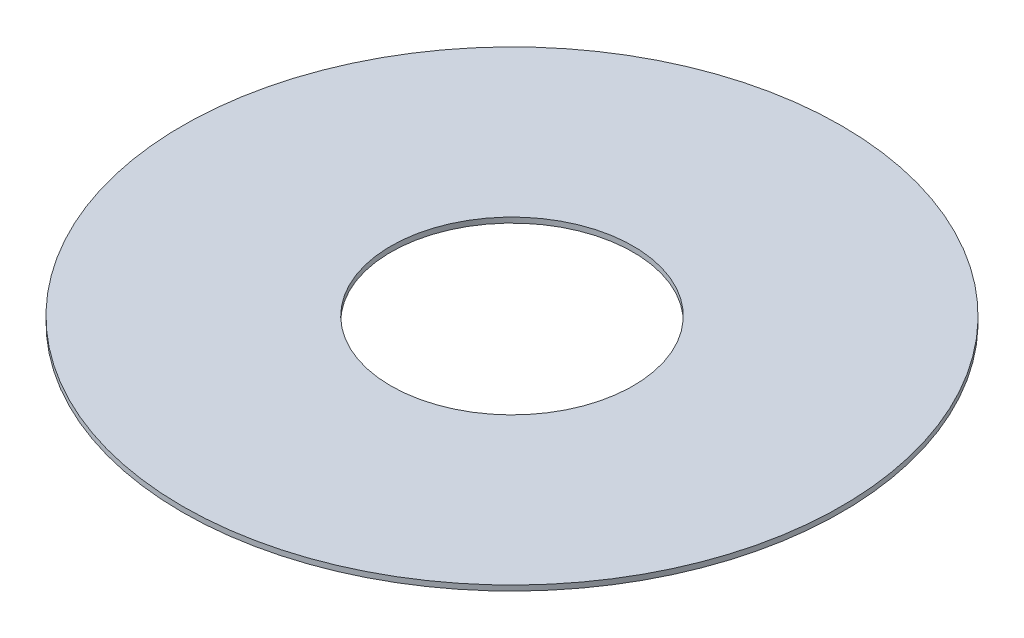
ISO-10303-21;
HEADER;
FILE_DESCRIPTION(('STEP AP214'),'2;1');
FILE_NAME('part.step','',(''),(''),'','','');
FILE_SCHEMA(('AUTOMOTIVE_DESIGN { 1 0 10303 214 1 1 1 1 }'));
ENDSEC;
DATA;
#1=APPLICATION_CONTEXT('core data for automotive mechanical design processes');
#2=APPLICATION_PROTOCOL_DEFINITION('international standard','automotive_design',2000,#1);
#3=PRODUCT_CONTEXT('',#1,'mechanical');
#4=PRODUCT('Part','Part','',(#3));
#5=PRODUCT_RELATED_PRODUCT_CATEGORY('part','',(#4));
#6=PRODUCT_DEFINITION_FORMATION('','',#4);
#7=PRODUCT_DEFINITION_CONTEXT('part definition',#1,'design');
#8=PRODUCT_DEFINITION('design','',#6,#7);
#9=PRODUCT_DEFINITION_SHAPE('','',#8);
#10=(LENGTH_UNIT() NAMED_UNIT(*) SI_UNIT(.MILLI.,.METRE.));
#11=(NAMED_UNIT(*) PLANE_ANGLE_UNIT() SI_UNIT($,.RADIAN.));
#12=(NAMED_UNIT(*) SI_UNIT($,.STERADIAN.) SOLID_ANGLE_UNIT());
#13=UNCERTAINTY_MEASURE_WITH_UNIT(LENGTH_MEASURE(1.E-05),#10,'distance_accuracy_value','');
#14=(GEOMETRIC_REPRESENTATION_CONTEXT(3) GLOBAL_UNCERTAINTY_ASSIGNED_CONTEXT((#13)) GLOBAL_UNIT_ASSIGNED_CONTEXT((#10,
#11,#12)) REPRESENTATION_CONTEXT('',''));
#15=CARTESIAN_POINT('',(0.,0.,0.));
#16=DIRECTION('',(0.,0.,1.));
#17=DIRECTION('',(1.,0.,0.));
#18=AXIS2_PLACEMENT_3D('',#15,#16,#17);
#19=CARTESIAN_POINT('',(-29.4584727390338,1.,1.69765412213674));
#20=DIRECTION('',(0.,1.,0.));
#21=DIRECTION('',(0.,0.,1.));
#22=AXIS2_PLACEMENT_3D('',#19,#20,#21);
#23=PLANE('',#22);
#24=CARTESIAN_POINT('',(-29.4584727390338,1.,1.69765412213674));
#25=DIRECTION('',(0.,1.,0.));
#26=DIRECTION('',(0.,0.,1.));
#27=AXIS2_PLACEMENT_3D('',#24,#25,#26);
#28=CIRCLE('',#27,62.8330061942196);
#29=CARTESIAN_POINT('',(-29.4584727390338,1.,64.5306603163563));
#30=VERTEX_POINT('',#29);
#31=EDGE_CURVE('E10',#30,#30,#28,.T.);
#32=ORIENTED_EDGE('',*,*,#31,.T.);
#33=EDGE_LOOP('',(#32));
#34=FACE_BOUND('',#33,.T.);
#35=CARTESIAN_POINT('',(-29.4584727390338,1.,1.69765412213674));
#36=DIRECTION('',(0.,1.,0.));
#37=DIRECTION('',(0.,0.,1.));
#38=AXIS2_PLACEMENT_3D('',#35,#36,#37);
#39=CIRCLE('',#38,23.1);
#40=CARTESIAN_POINT('',(-29.4584727390338,1.,24.7976541221367));
#41=VERTEX_POINT('',#40);
#42=EDGE_CURVE('E41',#41,#41,#39,.T.);
#43=ORIENTED_EDGE('',*,*,#42,.F.);
#44=EDGE_LOOP('',(#43));
#45=FACE_BOUND('',#44,.T.);
#46=ADVANCED_FACE('F30',(#34,#45),#23,.T.);
#47=CARTESIAN_POINT('',(-29.4584727390338,0.,1.69765412213674));
#48=DIRECTION('',(0.,1.,0.));
#49=DIRECTION('',(0.,0.,1.));
#50=AXIS2_PLACEMENT_3D('',#47,#48,#49);
#51=PLANE('',#50);
#52=CARTESIAN_POINT('',(-29.4584727390338,0.,1.69765412213674));
#53=DIRECTION('',(0.,1.,0.));
#54=DIRECTION('',(0.,0.,1.));
#55=AXIS2_PLACEMENT_3D('',#52,#53,#54);
#56=CIRCLE('',#55,62.8330061942196);
#57=CARTESIAN_POINT('',(-29.4584727390338,0.,64.5306603163563));
#58=VERTEX_POINT('',#57);
#59=EDGE_CURVE('E34',#58,#58,#56,.T.);
#60=ORIENTED_EDGE('',*,*,#59,.F.);
#61=EDGE_LOOP('',(#60));
#62=FACE_BOUND('',#61,.T.);
#63=CARTESIAN_POINT('',(-29.4584727390338,0.,1.69765412213674));
#64=DIRECTION('',(0.,1.,0.));
#65=DIRECTION('',(0.,0.,1.));
#66=AXIS2_PLACEMENT_3D('',#63,#64,#65);
#67=CIRCLE('',#66,23.1);
#68=CARTESIAN_POINT('',(-29.4584727390338,0.,24.7976541221367));
#69=VERTEX_POINT('',#68);
#70=EDGE_CURVE('E43',#69,#69,#67,.T.);
#71=ORIENTED_EDGE('',*,*,#70,.T.);
#72=EDGE_LOOP('',(#71));
#73=FACE_BOUND('',#72,.T.);
#74=ADVANCED_FACE('F53',(#62,#73),#51,.F.);
#75=CARTESIAN_POINT('',(-29.4584727390338,1.,1.69765412213674));
#76=DIRECTION('',(0.,-1.,0.));
#77=DIRECTION('',(0.,0.,-1.));
#78=AXIS2_PLACEMENT_3D('',#75,#76,#77);
#79=CYLINDRICAL_SURFACE('',#78,62.8330061942196);
#80=ORIENTED_EDGE('',*,*,#31,.F.);
#81=EDGE_LOOP('',(#80));
#82=FACE_BOUND('',#81,.T.);
#83=ORIENTED_EDGE('',*,*,#59,.T.);
#84=EDGE_LOOP('',(#83));
#85=FACE_BOUND('',#84,.T.);
#86=ADVANCED_FACE('F32',(#82,#85),#79,.T.);
#87=CARTESIAN_POINT('',(-29.4584727390338,1.,1.69765412213674));
#88=DIRECTION('',(0.,-1.,0.));
#89=DIRECTION('',(0.,0.,-1.));
#90=AXIS2_PLACEMENT_3D('',#87,#88,#89);
#91=CYLINDRICAL_SURFACE('',#90,23.1);
#92=ORIENTED_EDGE('',*,*,#42,.T.);
#93=EDGE_LOOP('',(#92));
#94=FACE_BOUND('',#93,.T.);
#95=ORIENTED_EDGE('',*,*,#70,.F.);
#96=EDGE_LOOP('',(#95));
#97=FACE_BOUND('',#96,.T.);
#98=ADVANCED_FACE('F49',(#94,#97),#91,.F.);
#99=CLOSED_SHELL('',(#46,#74,#86,#98));
#100=MANIFOLD_SOLID_BREP('B2',#99);
#101=ADVANCED_BREP_SHAPE_REPRESENTATION('',(#18,#100),#14);
#102=SHAPE_DEFINITION_REPRESENTATION(#9,#101);
ENDSEC;
END-ISO-10303-21;
